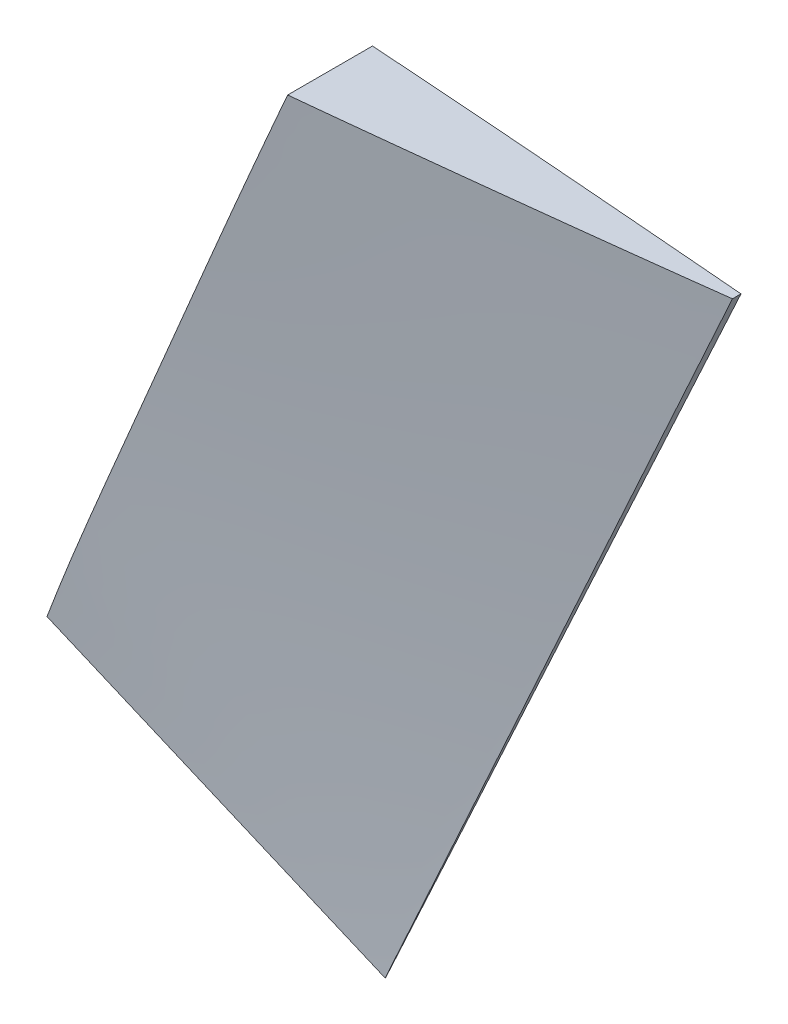
ISO-10303-21;
HEADER;
FILE_DESCRIPTION(('STEP AP214'),'2;1');
FILE_NAME('part.step','',(''),(''),'','','');
FILE_SCHEMA(('AUTOMOTIVE_DESIGN { 1 0 10303 214 1 1 1 1 }'));
ENDSEC;
DATA;
#1=APPLICATION_CONTEXT('core data for automotive mechanical design processes');
#2=APPLICATION_PROTOCOL_DEFINITION('international standard','automotive_design',2000,#1);
#3=PRODUCT_CONTEXT('',#1,'mechanical');
#4=PRODUCT('Part','Part','',(#3));
#5=PRODUCT_RELATED_PRODUCT_CATEGORY('part','',(#4));
#6=PRODUCT_DEFINITION_FORMATION('','',#4);
#7=PRODUCT_DEFINITION_CONTEXT('part definition',#1,'design');
#8=PRODUCT_DEFINITION('design','',#6,#7);
#9=PRODUCT_DEFINITION_SHAPE('','',#8);
#10=(LENGTH_UNIT() NAMED_UNIT(*) SI_UNIT(.MILLI.,.METRE.));
#11=(NAMED_UNIT(*) PLANE_ANGLE_UNIT() SI_UNIT($,.RADIAN.));
#12=(NAMED_UNIT(*) SI_UNIT($,.STERADIAN.) SOLID_ANGLE_UNIT());
#13=UNCERTAINTY_MEASURE_WITH_UNIT(LENGTH_MEASURE(1.E-05),#10,'distance_accuracy_value','');
#14=(GEOMETRIC_REPRESENTATION_CONTEXT(3) GLOBAL_UNCERTAINTY_ASSIGNED_CONTEXT((#13)) GLOBAL_UNIT_ASSIGNED_CONTEXT((#10,
#11,#12)) REPRESENTATION_CONTEXT('',''));
#15=CARTESIAN_POINT('',(0.,0.,0.));
#16=DIRECTION('',(0.,0.,1.));
#17=DIRECTION('',(1.,0.,0.));
#18=AXIS2_PLACEMENT_3D('',#15,#16,#17);
#19=CARTESIAN_POINT('',(450.,-130.454545454545,-0.340909090909091));
#20=CARTESIAN_POINT('',(450.,-130.454545454545,-0.340909090909106));
#21=CARTESIAN_POINT('',(449.920228231632,-130.628433739385,-0.340002593541267));
#22=CARTESIAN_POINT('',(449.545307522729,-130.454545454545,-0.371884642003111));
#23=CARTESIAN_POINT('',(449.762017008169,-130.97330610279,-0.338204738729196));
#24=CARTESIAN_POINT('',(448.643516643582,-130.454545454545,-0.433318404049909));
#25=CARTESIAN_POINT('',(449.525374432243,-131.489144882467,-0.335515618548219));
#26=CARTESIAN_POINT('',(447.297268547455,-130.454545454545,-0.557746313568504));
#27=CARTESIAN_POINT('',(449.211660247133,-132.172986079604,-0.331950684626506));
#28=CARTESIAN_POINT('',(445.511407799292,-130.454545454545,-0.708445804476921));
#29=CARTESIAN_POINT('',(448.427551942379,-133.882202899424,-0.323040362981583));
#30=CARTESIAN_POINT('',(441.047749772159,-130.454545454545,-1.08535856756838));
#31=CARTESIAN_POINT('',(447.408301592852,-136.103987607557,-0.311457972646045));
#32=CARTESIAN_POINT('',(435.244035903331,-130.454545454545,-1.5575400600512));
#33=CARTESIAN_POINT('',(445.918860764441,-139.350704037692,-0.294532508686824));
#34=CARTESIAN_POINT('',(426.762096799439,-130.454545454545,-2.23610225072945));
#35=CARTESIAN_POINT('',(444.194892841565,-143.108647873699,-0.274941964108699));
#36=CARTESIAN_POINT('',(416.943279708709,-130.454545454545,-3.00503063952915));
#37=CARTESIAN_POINT('',(442.236588852758,-147.377402707313,-0.252688509690426));
#38=CARTESIAN_POINT('',(405.783941156149,-130.454545454545,-3.80271359757555));
#39=CARTESIAN_POINT('',(440.123249434244,-151.984107238073,-0.228673289025499));
#40=CARTESIAN_POINT('',(393.730562897451,-130.454545454545,-4.50078656466239));
#41=CARTESIAN_POINT('',(438.480607326883,-155.564775242514,-0.210006901441855));
#42=CARTESIAN_POINT('',(384.353271804944,-130.454545454545,-4.87727949248391));
#43=CARTESIAN_POINT('',(436.760683946354,-159.313902694655,-0.190462317572211));
#44=CARTESIAN_POINT('',(374.53012498343,-130.454545454545,-5.10863819831831));
#45=CARTESIAN_POINT('',(434.65059264316,-163.913526910996,-0.166484007308637));
#46=CARTESIAN_POINT('',(362.475494514813,-130.454545454545,-5.22576076086143));
#47=CARTESIAN_POINT('',(432.227870836609,-169.194630090749,-0.138953077688741));
#48=CARTESIAN_POINT('',(348.635012099548,-130.454545454545,-5.04718611151635));
#49=CARTESIAN_POINT('',(430.117674255557,-173.79448379412,-0.11497357108587));
#50=CARTESIAN_POINT('',(336.582549321464,-130.454545454545,-4.78263940618856));
#51=CARTESIAN_POINT('',(428.632516792799,-177.031863248002,-0.0980967817363583));
#52=CARTESIAN_POINT('',(328.10042619195,-130.454545454545,-4.57892884845703));
#53=CARTESIAN_POINT('',(427.303541903018,-179.928792436182,-0.0829947943524758));
#54=CARTESIAN_POINT('',(320.510631665796,-130.454545454545,-4.3829699026139));
#55=CARTESIAN_POINT('',(425.817871302383,-183.167290439487,-0.0661121738907137));
#56=CARTESIAN_POINT('',(312.027201059706,-130.454545454545,-4.11838336615603));
#57=CARTESIAN_POINT('',(424.80112058878,-185.383626385326,-0.0545581885088574));
#58=CARTESIAN_POINT('',(306.22389672345,-130.454545454545,-3.86445582077895));
#59=CARTESIAN_POINT('',(424.17517976542,-186.74806619168,-0.0474452246070489));
#60=CARTESIAN_POINT('',(302.654005807109,-130.454545454545,-3.65622425154459));
#61=CARTESIAN_POINT('',(423.940270913742,-187.260125760466,-0.0447758058379719));
#62=CARTESIAN_POINT('',(301.3147605355,-130.454545454545,-3.56998476988364));
#63=CARTESIAN_POINT('',(423.705277623011,-187.772369391388,-0.0421054275342117));
#64=CARTESIAN_POINT('',(299.975128374365,-130.454545454545,-3.48252164984421));
#65=CARTESIAN_POINT('',(423.468929916839,-188.287565407379,-0.0394196581458948));
#66=CARTESIAN_POINT('',(298.629770656884,-130.454545454545,-3.36408099040977));
#67=CARTESIAN_POINT('',(423.198366270574,-188.877346094849,-0.0363450712565183));
#68=CARTESIAN_POINT('',(297.084298247488,-130.454545454545,-3.3152853906193));
#69=CARTESIAN_POINT('',(422.893539280858,-189.541814784696,-0.0328811281915655));
#70=CARTESIAN_POINT('',(295.348313714724,-130.454545454545,-3.17425916277371));
#71=CARTESIAN_POINT('',(422.441895643322,-190.526317687117,-0.0277488141286567));
#72=CARTESIAN_POINT('',(292.773890539923,-130.454545454545,-2.99674488123777));
#73=CARTESIAN_POINT('',(421.98911807893,-191.51329234866,-0.0226036145332886));
#74=CARTESIAN_POINT('',(290.210161536907,-130.454545454545,-2.63081723262685));
#75=CARTESIAN_POINT('',(421.535232774317,-192.502681687109,-0.017445826980876));
#76=CARTESIAN_POINT('',(287.652988807389,-130.454545454545,-2.21850885010889));
#77=CARTESIAN_POINT('',(421.193710642188,-193.247139269101,-0.013564893661225));
#78=CARTESIAN_POINT('',(285.718160266892,-130.454545454545,-1.91157573945579));
#79=CARTESIAN_POINT('',(420.849742018622,-193.996929767844,-0.00965615930252281));
#80=CARTESIAN_POINT('',(283.811789954257,-130.454545454545,-1.57794652407751));
#81=CARTESIAN_POINT('',(420.495200364726,-194.769767594573,-0.00562727687188866));
#82=CARTESIAN_POINT('',(281.721851115223,-130.454545454545,-1.10038705084091));
#83=CARTESIAN_POINT('',(420.240954683221,-195.323978017497,-0.00273812140024109));
#84=CARTESIAN_POINT('',(280.715924876587,-130.454545454545,-0.480848687373534));
#85=CARTESIAN_POINT('',(420.086812970164,-195.659979571103,-0.000986511024594086));
#86=CARTESIAN_POINT('',(279.659362327828,-130.454545454545,-0.000901808903122984));
#87=CARTESIAN_POINT('',(420.043325889078,-195.754773683073,-0.000492339648617432));
#88=CARTESIAN_POINT('',(279.947253509353,-130.454545454545,0.187389481134261));
#89=CARTESIAN_POINT('',(420.013652124563,-195.819457218637,-0.000155137779127834));
#90=CARTESIAN_POINT('',(280.114902417443,-130.454545454545,0.304929247207996));
#91=CARTESIAN_POINT('',(420.,-195.849216425099,0.));
#92=CARTESIAN_POINT('',(280.187278611803,-130.454545454545,0.357040530711377));
#93=B_SPLINE_SURFACE_WITH_KNOTS('',3,1,((#19,#20),(#21,#22),(#23,#24),(#25,#26),(#27,#28),(#29,
#30),(#31,#32),(#33,#34),(#35,#36),(#37,#38),(#39,#40),(#41,#42),(#43,#44),(#45,#46),(#47,#48),
(#49,#50),(#51,#52),(#53,#54),(#55,#56),(#57,#58),(#59,#60),(#61,#62),(#63,#64),(#65,#66),(#67,
#68),(#69,#70),(#71,#72),(#73,#74),(#75,#76),(#77,#78),(#79,#80),(#81,#82),(#83,#84),(#85,#86),
(#87,#88),(#89,#90),(#91,#92)),.UNSPECIFIED.,.F.,.F.,.F.,(4,1,1,1,1,1,1,1,1,1,1,1,1,1,1,1,1,1,1,
1,1,1,1,1,1,1,1,1,1,1,1,1,1,1,4),(2,2),(0.,0.00797717683684673,0.0158211223462278,
0.0236642575925995,0.0393485953479212,0.0942319528215491,0.125589292545331,0.188292678189065,
0.266628745109053,0.321419691426134,0.399626620040427,0.430892955845112,0.493412029479,
0.610635750359878,0.673165136500196,0.704431687584267,0.759151496635583,0.806062625478363,
0.852998747647773,0.86082656799592,0.868656707814277,0.87648963281565,0.884325897069009,
0.892291478431467,0.903545997442163,0.914808596040594,0.937455842185065,0.948823753881402,
0.960197126501825,0.971608055397993,0.983220616237981,0.995651291891405,0.997032623548492,
0.998634787543675,1.),(0.,1.),.UNSPECIFIED.);
#94=CARTESIAN_POINT('',(398.614550998263,-181.43067022012,-0.427699893424422));
#95=CARTESIAN_POINT('',(402.45676464004,-183.22779064241,-0.358518283381793));
#96=CARTESIAN_POINT('',(406.298985972093,-185.024914661675,-0.289865295132148));
#97=CARTESIAN_POINT('',(413.983444016749,-188.619169894159,-0.153616562218825));
#98=CARTESIAN_POINT('',(417.825680729353,-190.416301107377,-0.0860208175551474));
#99=CARTESIAN_POINT('',(421.667925132232,-192.213435917571,-0.0189536946844526));
#100=B_SPLINE_CURVE_WITH_KNOTS('',3,(#94,#95,#96,#97,#98,#99),.UNSPECIFIED.,.F.,.F.,(4,2,4),(0.,
12.7268729325426,25.4537458650852),.UNSPECIFIED.);
#101=CARTESIAN_POINT('',(398.614550998263,-181.43067022012,-0.427699893424439));
#102=VERTEX_POINT('',#101);
#103=CARTESIAN_POINT('',(421.667925132232,-192.213435917571,-0.018953694684444));
#104=VERTEX_POINT('',#103);
#105=EDGE_CURVE('E159',#102,#104,#100,.T.);
#106=CARTESIAN_POINT('',(418.329976182492,-138.454545454545,-2.43344554744445));
#107=CARTESIAN_POINT('',(418.124501030356,-138.902444786763,-2.41977298470673));
#108=CARTESIAN_POINT('',(417.919034875398,-139.350324506732,-2.40533292954151));
#109=CARTESIAN_POINT('',(417.50812210439,-140.246041355323,-2.37496045053862));
#110=CARTESIAN_POINT('',(417.302675488305,-140.693878484019,-2.35902802938084));
#111=CARTESIAN_POINT('',(416.686372314229,-142.037309926913,-2.30905656219624));
#112=CARTESIAN_POINT('',(416.275546273283,-142.932837719373,-2.27284290020665));
#113=CARTESIAN_POINT('',(415.453992594572,-144.723678802838,-2.19564429085679));
#114=CARTESIAN_POINT('',(415.043264953058,-145.618992102015,-2.15465957034874));
#115=CARTESIAN_POINT('',(414.221881024471,-147.409463160363,-2.06871873170473));
#116=CARTESIAN_POINT('',(413.811224737652,-148.304620918981,-2.02376259974717));
#117=CARTESIAN_POINT('',(413.195284191508,-149.647261897396,-1.95462014402665));
#118=CARTESIAN_POINT('',(412.989982973283,-150.094782084587,-1.93128853626097));
#119=CARTESIAN_POINT('',(412.579388382882,-150.989805355972,-1.8842430018646));
#120=CARTESIAN_POINT('',(412.374095010697,-151.437308440186,-1.86052907570626));
#121=CARTESIAN_POINT('',(411.758219652784,-152.779807319841,-1.7890475564416));
#122=CARTESIAN_POINT('',(411.347644559846,-153.67478809022,-1.74094046552913));
#123=CARTESIAN_POINT('',(410.526479901909,-155.464781177502,-1.64545237755797));
#124=CARTESIAN_POINT('',(410.115890336921,-156.359793494378,-1.59807137992408));
#125=CARTESIAN_POINT('',(409.2946735918,-158.149900122469,-1.50524597129407));
#126=CARTESIAN_POINT('',(408.884046411736,-159.044994433532,-1.45980155678513));
#127=CARTESIAN_POINT('',(408.062737691389,-160.835301551276,-1.37170219790142));
#128=CARTESIAN_POINT('',(407.65205615084,-161.730514358539,-1.32904726777316));
#129=CARTESIAN_POINT('',(406.830637853039,-163.521060335668,-1.24690556248461));
#130=CARTESIAN_POINT('',(406.419901095784,-164.416393505542,-1.20741878752368));
#131=CARTESIAN_POINT('',(405.598379779897,-166.207164043799,-1.13152295577012));
#132=CARTESIAN_POINT('',(405.187595221424,-167.102601411836,-1.09511388904415));
#133=CARTESIAN_POINT('',(404.571399298036,-168.44579906728,-1.04178885977681));
#134=CARTESIAN_POINT('',(404.365997458045,-168.893538592046,-1.02422861034925));
#135=CARTESIAN_POINT('',(403.955189630234,-169.789026683107,-0.989385053070753));
#136=CARTESIAN_POINT('',(403.749783642413,-170.236775249405,-0.972101745297287));
#137=CARTESIAN_POINT('',(403.338973726159,-171.132267892901,-0.937447460374475));
#138=CARTESIAN_POINT('',(403.133569797721,-171.580011970109,-0.920076483557113));
#139=CARTESIAN_POINT('',(402.825468476758,-172.251618120442,-0.893707493865172));
#140=CARTESIAN_POINT('',(402.722768765811,-172.475485247315,-0.884865740369396));
#141=CARTESIAN_POINT('',(402.51737132289,-172.923215187247,-0.86703223569354));
#142=CARTESIAN_POINT('',(402.414673590923,-173.147078000294,-0.858040484105255));
#143=CARTESIAN_POINT('',(402.23491614752,-173.538917295823,-0.842112663908749));
#144=CARTESIAN_POINT('',(402.157855710809,-173.706895359274,-0.835223726115662));
#145=CARTESIAN_POINT('',(402.003737167091,-174.042846407839,-0.821299671711394));
#146=CARTESIAN_POINT('',(401.926679060081,-174.210819392955,-0.814264555169191));
#147=CARTESIAN_POINT('',(401.772566284141,-174.546757868789,-0.800023897979708));
#148=CARTESIAN_POINT('',(401.695511615184,-174.714723359561,-0.79281835888474));
#149=CARTESIAN_POINT('',(401.541405386301,-175.050647563972,-0.778212628709008));
#150=CARTESIAN_POINT('',(401.464353826378,-175.218606277602,-0.770812437393759));
#151=CARTESIAN_POINT('',(401.348779489199,-175.470537802684,-0.75955128969145));
#152=CARTESIAN_POINT('',(401.310255347104,-175.554513589242,-0.755770777351224));
#153=CARTESIAN_POINT('',(401.233208136475,-175.722462822184,-0.748148924534132));
#154=CARTESIAN_POINT('',(401.194685067942,-175.806436268568,-0.744307584103872));
#155=CARTESIAN_POINT('',(401.117640465881,-175.974379815296,-0.736540023284931));
#156=CARTESIAN_POINT('',(401.079118932352,-176.058349915643,-0.732613803004664));
#157=CARTESIAN_POINT('',(401.002077291851,-176.226287006697,-0.724678021698815));
#158=CARTESIAN_POINT('',(400.963557184881,-176.310253997398,-0.72066846052391));
#159=CARTESIAN_POINT('',(400.886516042725,-176.478190002148,-0.712645665474862));
#160=CARTESIAN_POINT('',(400.84799500754,-176.562159016192,-0.708632431507985));
#161=CARTESIAN_POINT('',(400.770953780904,-176.730095205094,-0.700568010909255));
#162=CARTESIAN_POINT('',(400.732433589449,-176.814062379958,-0.696516824452922));
#163=CARTESIAN_POINT('',(400.674657416914,-176.940004173052,-0.690236101523164));
#164=CARTESIAN_POINT('',(400.655399528339,-176.981982949284,-0.688108554020083));
#165=CARTESIAN_POINT('',(400.616885818008,-177.065935996449,-0.683748379243098));
#166=CARTESIAN_POINT('',(400.597629996253,-177.107910267381,-0.681515751937869));
#167=CARTESIAN_POINT('',(400.539864044893,-177.233829780131,-0.674740613284575));
#168=CARTESIAN_POINT('',(400.501355500184,-177.317771567156,-0.670120853144431));
#169=CARTESIAN_POINT('',(400.437158619949,-177.4577093625,-0.662903701716677));
#170=CARTESIAN_POINT('',(400.411473564835,-177.513698220101,-0.66014532604083));
#171=CARTESIAN_POINT('',(400.360094979825,-177.625694408824,-0.655133960014648));
#172=CARTESIAN_POINT('',(400.334401449964,-177.681701739869,-0.652880967598505));
#173=CARTESIAN_POINT('',(400.283010772088,-177.793724288891,-0.648638231293811));
#174=CARTESIAN_POINT('',(400.257313624061,-177.849739506893,-0.646648488231127));
#175=CARTESIAN_POINT('',(400.205919361301,-177.961769870326,-0.642660420700276));
#176=CARTESIAN_POINT('',(400.180222246566,-178.017785015758,-0.640662096231791));
#177=CARTESIAN_POINT('',(400.103139844435,-178.185810959924,-0.63417316934824));
#178=CARTESIAN_POINT('',(400.051761740874,-178.297806099174,-0.629188510561764));
#179=CARTESIAN_POINT('',(399.949018653572,-178.521767778794,-0.61851900008417));
#180=CARTESIAN_POINT('',(399.897653669917,-178.633734318979,-0.6128341439467));
#181=CARTESIAN_POINT('',(399.820605072007,-178.801686575946,-0.604437045282648));
#182=CARTESIAN_POINT('',(399.794922725036,-178.857669530278,-0.60165978454755));
#183=CARTESIAN_POINT('',(399.743556764957,-178.969638198894,-0.596173159132351));
#184=CARTESIAN_POINT('',(399.717873151848,-179.02562391318,-0.593463794523611));
#185=CARTESIAN_POINT('',(399.640823443593,-179.193578590504,-0.585285556704713));
#186=CARTESIAN_POINT('',(399.589458190804,-179.305545717352,-0.579766509610423));
#187=CARTESIAN_POINT('',(399.512423073757,-179.473468588434,-0.570906604565404));
#188=CARTESIAN_POINT('',(399.486747488261,-179.52943680395,-0.567856499690711));
#189=CARTESIAN_POINT('',(399.435402210096,-179.641360389668,-0.561483211600029));
#190=CARTESIAN_POINT('',(399.409732517425,-179.697315759871,-0.558160028393684));
#191=CARTESIAN_POINT('',(399.332732093306,-179.865163006533,-0.54782477576804));
#192=CARTESIAN_POINT('',(399.281409881338,-179.977036312036,-0.540446987861615));
#193=CARTESIAN_POINT('',(399.178780715239,-180.200749663671,-0.524926269444932));
#194=CARTESIAN_POINT('',(399.127473763129,-180.312589705397,-0.516783263035843));
#195=CARTESIAN_POINT('',(399.0248754874,-180.53623572151,-0.499938988772779));
#196=CARTESIAN_POINT('',(398.973584163912,-180.648041695616,-0.49123771642716));
#197=CARTESIAN_POINT('',(398.870999413006,-180.871658230019,-0.473481019394629));
#198=CARTESIAN_POINT('',(398.819705988255,-180.983468784503,-0.464425506911519));
#199=CARTESIAN_POINT('',(398.717125407099,-181.207076229591,-0.446144620998084));
#200=CARTESIAN_POINT('',(398.665838250591,-181.318873120422,-0.43691925094031));
#201=CARTESIAN_POINT('',(398.614550998263,-181.43067022012,-0.427699893424429));
#202=B_SPLINE_CURVE_WITH_KNOTS('',3,(#106,#107,#108,#109,#110,#111,#112,#113,#114,#115,#116,
#117,#118,#119,#120,#121,#122,#123,#124,#125,#126,#127,#128,#129,#130,#131,#132,#133,#134,#135,
#136,#137,#138,#139,#140,#141,#142,#143,#144,#145,#146,#147,#148,#149,#150,#151,#152,#153,#154,
#155,#156,#157,#158,#159,#160,#161,#162,#163,#164,#165,#166,#167,#168,#169,#170,#171,#172,#173,
#174,#175,#176,#177,#178,#179,#180,#181,#182,#183,#184,#185,#186,#187,#188,#189,#190,#191,#192,
#193,#194,#195,#196,#197,#198,#199,#200,#201),.UNSPECIFIED.,.F.,.F.,(4,2,2,2,2,2,2,2,2,2,2,2,2,
2,2,2,2,2,2,2,2,2,2,2,2,2,2,2,2,2,2,2,2,2,2,2,2,2,2,2,2,2,2,2,2,2,2,4),(0.,1.47891307515781,
2.95782349463871,5.91560001796166,8.87323596360744,11.8308822030435,13.3096335313171,
14.7883830327641,17.7458974076548,20.7034094395692,23.6609161065599,26.6184378770072,
29.5759598335588,32.5334722443277,34.0122287076632,35.490985584583,36.9697368659515,
37.709112975692,38.4484910978998,39.0033077617632,39.5581241638288,40.1129355142401,
40.6677475330287,40.9451515763426,41.2225554071194,41.499958883598,41.7773628571418,
42.0547740394756,42.3321839395015,42.470886731057,42.609589563961,42.8869957410793,
43.0719773259479,43.256958154671,43.441939563703,43.6269209796161,43.9968711582598,
44.3668236862604,44.5517897804406,44.7367560690163,45.1066865669963,45.2916423076045,
45.4765980416811,45.8465085417035,46.2164557704083,46.586405975973,46.9564484596269,
47.3264836039297),.UNSPECIFIED.);
#203=CARTESIAN_POINT('',(418.329976182492,-138.454545454545,-2.43344554744446));
#204=VERTEX_POINT('',#203);
#205=EDGE_CURVE('E142',#204,#102,#202,.T.);
#206=CARTESIAN_POINT('',(446.329976182488,-138.454545454545,-0.299204274801055));
#207=CARTESIAN_POINT('',(445.552536679029,-138.454545454545,-0.362710519299194));
#208=CARTESIAN_POINT('',(444.77508324772,-138.454545454545,-0.426046564859201));
#209=CARTESIAN_POINT('',(443.220144077697,-138.454545454545,-0.55232570928262));
#210=CARTESIAN_POINT('',(442.442658338968,-138.454545454545,-0.615268807945163));
#211=CARTESIAN_POINT('',(440.887650812662,-138.454545454545,-0.740709451540716));
#212=CARTESIAN_POINT('',(440.110129025081,-138.454545454545,-0.803206996425302));
#213=CARTESIAN_POINT('',(438.555053065399,-138.454545454545,-0.927668132712082));
#214=CARTESIAN_POINT('',(437.777498893861,-138.454545454545,-0.9896317311674));
#215=CARTESIAN_POINT('',(436.222340356082,-138.454545454545,-1.1129267307817));
#216=CARTESIAN_POINT('',(435.444735989842,-138.454545454545,-1.17425813196287));
#217=CARTESIAN_POINT('',(433.889468605383,-138.454545454545,-1.29617335247123));
#218=CARTESIAN_POINT('',(433.111805587143,-138.454545454545,-1.35675717153314));
#219=CARTESIAN_POINT('',(430.000916497162,-138.454545454545,-1.59732551756707));
#220=CARTESIAN_POINT('',(427.667411716101,-138.454545454545,-1.77376074310555));
#221=CARTESIAN_POINT('',(424.166457108495,-138.454545454545,-2.02906265231637));
#222=CARTESIAN_POINT('',(422.999348585287,-138.454545454545,-2.11260530143197));
#223=CARTESIAN_POINT('',(420.664867568699,-138.454545454545,-2.27596841140747));
#224=CARTESIAN_POINT('',(419.497495074471,-138.454545454545,-2.35578886014299));
#225=CARTESIAN_POINT('',(418.329976182492,-138.454545454545,-2.43344554744444));
#226=B_SPLINE_CURVE_WITH_KNOTS('',3,(#206,#207,#208,#209,#210,#211,#212,#213,#214,#215,#216,
#217,#218,#219,#220,#221,#222,#223,#224,#225),.UNSPECIFIED.,.F.,.F.,(4,2,2,2,2,2,2,2,2,4),(0.,
2.3400869852755,4.68017516667034,7.02026360238659,9.36032107935536,11.7003784742111,
14.0404366994646,21.0609052764254,24.571184153648,28.0814744641483),.UNSPECIFIED.);
#227=CARTESIAN_POINT('',(446.329976182493,-138.454545454545,-0.299204274801072));
#228=VERTEX_POINT('',#227);
#229=EDGE_CURVE('E130',#228,#204,#226,.T.);
#230=DIRECTION('',(-0.416965212118543,-0.908910095089014,0.00473824104680372));
#231=VECTOR('',#230,1.);
#232=CARTESIAN_POINT('',(435.,-163.151880939822,-0.170454545454545));
#233=LINE('',#232,#231);
#234=EDGE_CURVE('E136',#228,#104,#233,.T.);
#235=ORIENTED_EDGE('',*,*,#105,.F.);
#236=ORIENTED_EDGE('',*,*,#205,.F.);
#237=ORIENTED_EDGE('',*,*,#229,.F.);
#238=ORIENTED_EDGE('',*,*,#234,.T.);
#239=EDGE_LOOP('',(#235,#236,#237,#238));
#240=FACE_BOUND('',#239,.T.);
#241=ADVANCED_FACE('F85',(#240),#93,.T.);
#242=CARTESIAN_POINT('',(420.,-195.849216425099,0.));
#243=CARTESIAN_POINT('',(280.187278611803,-130.454545454545,0.35704053071139));
#244=CARTESIAN_POINT('',(420.071151014709,-195.694119851896,0.000808534258051717));
#245=CARTESIAN_POINT('',(280.564482881045,-130.454545454545,0.628629812061183));
#246=CARTESIAN_POINT('',(420.221036678357,-195.367395729979,0.00251178043587693));
#247=CARTESIAN_POINT('',(281.087036720018,-130.454545454545,1.08828051002727));
#248=CARTESIAN_POINT('',(420.44583156894,-194.877382799796,0.00506626782885661));
#249=CARTESIAN_POINT('',(282.274174192472,-130.454545454545,1.75247690226862));
#250=CARTESIAN_POINT('',(420.672097389311,-194.384163503961,0.00763747033307473));
#251=CARTESIAN_POINT('',(283.432642754446,-130.454545454545,2.2838866728495));
#252=CARTESIAN_POINT('',(420.890951919168,-193.907099504947,0.0101244536269029));
#253=CARTESIAN_POINT('',(284.611810181569,-130.454545454545,2.71697102781261));
#254=CARTESIAN_POINT('',(421.105531130917,-193.439354939965,0.0125628537604167));
#255=CARTESIAN_POINT('',(285.782029494811,-130.454545454545,3.07884482997964));
#256=CARTESIAN_POINT('',(421.38800658309,-192.823608631562,0.0157728020805624));
#257=CARTESIAN_POINT('',(287.338994271212,-130.454545454545,3.50546181963184));
#258=CARTESIAN_POINT('',(421.669366361993,-192.210294292705,0.0189700722953707));
#259=CARTESIAN_POINT('',(288.898985076652,-130.454545454545,3.89238031397816));
#260=CARTESIAN_POINT('',(421.961982914711,-191.572442186519,0.0222952603944451));
#261=CARTESIAN_POINT('',(290.518535065987,-130.454545454545,4.30673885902615));
#262=CARTESIAN_POINT('',(422.198093289187,-191.057763511467,0.0249783328316695));
#263=CARTESIAN_POINT('',(291.830238795819,-130.454545454545,4.62128878184873));
#264=CARTESIAN_POINT('',(422.447647314156,-190.513780066393,0.027814174024496));
#265=CARTESIAN_POINT('',(293.214948862898,-130.454545454545,4.96084399636247));
#266=CARTESIAN_POINT('',(422.698654705306,-189.966628541212,0.0306665307421089));
#267=CARTESIAN_POINT('',(294.616035403953,-130.454545454545,5.2668486340114));
#268=CARTESIAN_POINT('',(422.948733034197,-189.421502206722,0.0335083299340544));
#269=CARTESIAN_POINT('',(296.016447086324,-130.454545454545,5.54983796405608));
#270=CARTESIAN_POINT('',(423.610047730074,-187.979953641894,0.0410232696599231));
#271=CARTESIAN_POINT('',(299.731773505077,-130.454545454545,6.23626957204611));
#272=CARTESIAN_POINT('',(424.516068043252,-186.004990299463,0.0513189550369489));
#273=CARTESIAN_POINT('',(304.866582782226,-130.454545454545,6.91262465631221));
#274=CARTESIAN_POINT('',(425.666420599626,-183.497426068655,0.0643911431775677));
#275=CARTESIAN_POINT('',(311.415146319476,-130.454545454545,7.47468891132479));
#276=CARTESIAN_POINT('',(426.648992540881,-181.355593775213,0.0755567334191007));
#277=CARTESIAN_POINT('',(317.018524509153,-130.454545454545,7.81425292200262));
#278=CARTESIAN_POINT('',(427.630468427647,-179.216150685859,0.086709868495992));
#279=CARTESIAN_POINT('',(322.620466347349,-130.454545454545,8.05767756577288));
#280=CARTESIAN_POINT('',(428.61140122065,-177.077891444439,0.0978568320528347));
#281=CARTESIAN_POINT('',(328.221716601722,-130.454545454545,8.23485378957612));
#282=CARTESIAN_POINT('',(429.837150819099,-174.405975055008,0.111785804762494));
#283=CARTESIAN_POINT('',(335.222522761133,-130.454545454545,8.39552973880935));
#284=CARTESIAN_POINT('',(431.71633953175,-170.30967746983,0.133140221951699));
#285=CARTESIAN_POINT('',(345.957430556797,-130.454545454545,8.53689315986166));
#286=CARTESIAN_POINT('',(433.922537048939,-165.500558778742,0.158210648283398));
#287=CARTESIAN_POINT('',(358.562250470617,-130.454545454545,8.48861665967984));
#288=CARTESIAN_POINT('',(435.883965833054,-161.22499244643,0.180499611739247));
#289=CARTESIAN_POINT('',(369.76341516376,-130.454545454545,8.15389854092615));
#290=CARTESIAN_POINT('',(437.519955552744,-157.658825465417,0.199090404008459));
#291=CARTESIAN_POINT('',(379.099265936947,-130.454545454545,7.70948541929537));
#292=CARTESIAN_POINT('',(438.829910757077,-154.803355812967,0.213976258603151));
#293=CARTESIAN_POINT('',(386.567440595166,-130.454545454545,7.22127042959768));
#294=CARTESIAN_POINT('',(440.633334547504,-150.872212299785,0.234469710767096));
#295=CARTESIAN_POINT('',(396.836789768627,-130.454545454545,6.39031919584628));
#296=CARTESIAN_POINT('',(442.439025038754,-146.936127781454,0.254988920894931));
#297=CARTESIAN_POINT('',(407.10519128926,-130.454545454545,5.39914332150518));
#298=CARTESIAN_POINT('',(444.245616478655,-142.998079355102,0.275518369075627));
#299=CARTESIAN_POINT('',(417.367847728984,-130.454545454545,4.30402449553109));
#300=CARTESIAN_POINT('',(445.560420545534,-140.132040043627,0.290459324381062));
#301=CARTESIAN_POINT('',(424.834343364726,-130.454545454545,3.48430379735418));
#302=CARTESIAN_POINT('',(446.629272324157,-137.802133030982,0.302605367319963));
#303=CARTESIAN_POINT('',(430.902643251865,-130.454545454545,2.80451180973997));
#304=CARTESIAN_POINT('',(447.698757611424,-135.470845082026,0.314758609220726));
#305=CARTESIAN_POINT('',(436.971792813155,-130.454545454545,2.09993903056582));
#306=CARTESIAN_POINT('',(448.604315352224,-133.49689006521,0.325049038093456));
#307=CARTESIAN_POINT('',(442.105109979127,-130.454545454545,1.45684168825263));
#308=CARTESIAN_POINT('',(449.181137684725,-132.239519843798,0.33160383732642));
#309=CARTESIAN_POINT('',(445.370231574772,-130.454545454545,1.01145852772402));
#310=CARTESIAN_POINT('',(449.511176048923,-131.520094835986,0.335354273283212));
#311=CARTESIAN_POINT('',(447.236915623379,-130.454545454545,0.745780183520897));
#312=CARTESIAN_POINT('',(449.756671433744,-130.984958505481,0.338143993565268));
#313=CARTESIAN_POINT('',(448.623337919136,-130.454545454545,0.533918312824093));
#314=CARTESIAN_POINT('',(449.919634152885,-130.629728725524,0.339995842646417));
#315=CARTESIAN_POINT('',(449.545320074736,-130.454545454545,0.404655612161846));
#316=CARTESIAN_POINT('',(450.,-130.454545454545,0.340909090909091));
#317=CARTESIAN_POINT('',(450.,-130.454545454545,0.340909090909076));
#318=B_SPLINE_SURFACE_WITH_KNOTS('',3,1,((#242,#243),(#244,#245),(#246,#247),(#248,#249),(#250,
#251),(#252,#253),(#254,#255),(#256,#257),(#258,#259),(#260,#261),(#262,#263),(#264,#265),(#266,
#267),(#268,#269),(#270,#271),(#272,#273),(#274,#275),(#276,#277),(#278,#279),(#280,#281),(#282,
#283),(#284,#285),(#286,#287),(#288,#289),(#290,#291),(#292,#293),(#294,#295),(#296,#297),(#298,
#299),(#300,#301),(#302,#303),(#304,#305),(#306,#307),(#308,#309),(#310,#311),(#312,#313),(#314,
#315),(#316,#317)),.UNSPECIFIED.,.F.,.F.,.F.,(4,1,1,1,1,1,1,1,1,1,1,1,1,1,1,1,1,1,1,1,1,1,1,1,1,
1,1,1,1,1,1,1,1,1,1,4),(2,2),(0.,0.00711510147085559,0.0149885663648619,0.0224794890582212,
0.029741683507975,0.03687401935055,0.0439374102331422,0.0579892287252576,0.065009997240863,
0.0731990655049966,0.0816002661728324,0.0899653997377364,0.0982998046199896,0.106608099061953,
0.156096869325381,0.188901835937816,0.221643354699399,0.254354063450871,0.28704942461446,
0.319736633999615,0.37692902329587,0.474968295879467,0.540356385718565,0.573071901707337,
0.638567267848534,0.67135190615186,0.753414280750055,0.819136316973473,0.852011050141986,
0.884894687437888,0.926021494835804,0.958959578868695,0.97545046151791,0.983703728085889,
0.991963415288466,1.),(0.,1.),.UNSPECIFIED.);
#319=CARTESIAN_POINT('',(421.667925132241,-192.213435917576,0.0189536946844504));
#320=CARTESIAN_POINT('',(417.82567181883,-190.416296939654,0.131195570276135));
#321=CARTESIAN_POINT('',(413.983430650959,-188.619163642572,0.243939670936143));
#322=CARTESIAN_POINT('',(406.2989726063,-185.024908410086,0.470432322392807));
#323=CARTESIAN_POINT('',(402.456755729511,-183.227786474683,0.584180873189464));
#324=CARTESIAN_POINT('',(398.614550998263,-181.43067022012,0.698431649054445));
#325=B_SPLINE_CURVE_WITH_KNOTS('',3,(#319,#320,#321,#322,#323,#324),.UNSPECIFIED.,.F.,.F.,(4,2,
4),(0.,12.7297662431861,25.4595324863723),.UNSPECIFIED.);
#326=CARTESIAN_POINT('',(421.667925132232,-192.213435917571,0.018953694684444));
#327=VERTEX_POINT('',#326);
#328=CARTESIAN_POINT('',(398.614550998263,-181.43067022012,0.698431649054431));
#329=VERTEX_POINT('',#328);
#330=EDGE_CURVE('E143',#327,#329,#325,.T.);
#331=DIRECTION('',(0.416965212118383,0.908910095089087,0.00473824104680329));
#332=VECTOR('',#331,1.);
#333=CARTESIAN_POINT('',(435.,-163.151880939822,0.170454545454545));
#334=LINE('',#333,#332);
#335=CARTESIAN_POINT('',(446.329976182489,-138.454545454543,0.299204274801054));
#336=VERTEX_POINT('',#335);
#337=EDGE_CURVE('E145',#327,#336,#334,.T.);
#338=CARTESIAN_POINT('',(418.329976182492,-138.454545454545,3.52270971745889));
#339=CARTESIAN_POINT('',(419.498048967753,-138.454545454545,3.40150156970858));
#340=CARTESIAN_POINT('',(420.665906357908,-138.454545454545,3.27823515127319));
#341=CARTESIAN_POINT('',(423.00123108525,-138.454545454545,3.02809050842047));
#342=CARTESIAN_POINT('',(424.168698423564,-138.454545454545,2.90121229453176));
#343=CARTESIAN_POINT('',(426.503259550903,-138.454545454545,2.64435149913933));
#344=CARTESIAN_POINT('',(427.670353349035,-138.454545454545,2.51436900028102));
#345=CARTESIAN_POINT('',(430.004220277665,-138.454545454545,2.25155601493259));
#346=CARTESIAN_POINT('',(431.170993408126,-138.454545454545,2.1187255281184));
#347=CARTESIAN_POINT('',(433.50436772263,-138.454545454545,1.85034359651225));
#348=CARTESIAN_POINT('',(434.670968869533,-138.454545454545,1.71479182888));
#349=CARTESIAN_POINT('',(437.003844450507,-138.454545454545,1.44091989825975));
#350=CARTESIAN_POINT('',(438.170118885085,-138.454545454545,1.30259973958974));
#351=CARTESIAN_POINT('',(440.502305000141,-138.454545454545,1.02265938331524));
#352=CARTESIAN_POINT('',(441.668216669843,-138.454545454545,0.881039095682787));
#353=CARTESIAN_POINT('',(443.416698382956,-138.454545454545,0.665461290645123));
#354=CARTESIAN_POINT('',(443.999462455764,-138.454545454544,0.593077316113604));
#355=CARTESIAN_POINT('',(445.16483895522,-138.454545454545,0.447093931859528));
#356=CARTESIAN_POINT('',(445.747451381696,-138.454545454546,0.37349452076777));
#357=CARTESIAN_POINT('',(446.329976182491,-138.454545454549,0.299204274801032));
#358=B_SPLINE_CURVE_WITH_KNOTS('',3,(#338,#339,#340,#341,#342,#343,#344,#345,#346,#347,#348,
#349,#350,#351,#352,#353,#354,#355,#356,#357),.UNSPECIFIED.,.F.,.F.,(4,2,2,2,2,2,2,2,2,4),(0.,
3.52302961117005,7.04604895352801,10.5689746068232,14.0919006609817,17.6152471580955,
21.1385881601136,24.66202539213,26.4237508647475,28.1854783220982),.UNSPECIFIED.);
#359=CARTESIAN_POINT('',(418.329976182492,-138.454545454545,3.52270971745888));
#360=VERTEX_POINT('',#359);
#361=EDGE_CURVE('E105',#360,#336,#358,.T.);
#362=CARTESIAN_POINT('',(398.614550998263,-181.43067022012,0.698431649054444));
#363=CARTESIAN_POINT('',(398.640085582678,-181.375009361915,0.705496454730695));
#364=CARTESIAN_POINT('',(398.665617554194,-181.319354199364,0.712615028765063));
#365=CARTESIAN_POINT('',(398.716678912353,-181.208049508826,0.726905681032231));
#366=CARTESIAN_POINT('',(398.742208298995,-181.152399980842,0.734077759296658));
#367=CARTESIAN_POINT('',(398.793267046148,-181.041100981833,0.748421364418086));
#368=CARTESIAN_POINT('',(398.81879640666,-180.985451510808,0.755592891276181));
#369=CARTESIAN_POINT('',(398.869858839087,-180.874144478557,0.769859414596927));
#370=CARTESIAN_POINT('',(398.895391911,-180.818486917336,0.776954411097843));
#371=CARTESIAN_POINT('',(398.971997244953,-180.651500897055,0.798142031638348));
#372=CARTESIAN_POINT('',(399.023074195384,-180.540162218134,0.812136883855771));
#373=CARTESIAN_POINT('',(399.099681954383,-180.373170911684,0.833290156204857));
#374=CARTESIAN_POINT('',(399.125216618733,-180.317509879232,0.840368085622345));
#375=CARTESIAN_POINT('',(399.176283228135,-180.20619374192,0.854580194933914));
#376=CARTESIAN_POINT('',(399.201815173183,-180.150538637064,0.861714374869066));
#377=CARTESIAN_POINT('',(399.278402580565,-179.983591693523,0.883067828470956));
#378=CARTESIAN_POINT('',(399.329460349373,-179.872294827134,0.897241034961811));
#379=CARTESIAN_POINT('',(399.431606620326,-179.649634101139,0.924932701430059));
#380=CARTESIAN_POINT('',(399.482695122346,-179.538270241806,0.938451164045169));
#381=CARTESIAN_POINT('',(399.584890793273,-179.315501832643,0.965055263752241));
#382=CARTESIAN_POINT('',(399.63599796189,-179.204097283444,0.978140907269558));
#383=CARTESIAN_POINT('',(399.738227930392,-178.98125411166,1.00396158397066));
#384=CARTESIAN_POINT('',(399.789350730339,-178.869815488941,1.0166966157398));
#385=CARTESIAN_POINT('',(399.891605680746,-178.646917861041,1.04176109330671));
#386=CARTESIAN_POINT('',(399.94273782856,-178.535458861629,1.05409060116571));
#387=CARTESIAN_POINT('',(400.045017591669,-178.312507146449,1.07837169727474));
#388=CARTESIAN_POINT('',(400.096165206932,-178.201014430746,1.09032328626326));
#389=CARTESIAN_POINT('',(400.249630158082,-177.866488097881,1.12565033610567));
#390=CARTESIAN_POINT('',(400.351968689906,-177.643408277339,1.14849785785438));
#391=CARTESIAN_POINT('',(400.556691764759,-177.197148340002,1.19288736043821));
#392=CARTESIAN_POINT('',(400.659076306331,-176.973968226384,1.21442938003261));
#393=CARTESIAN_POINT('',(400.863887314638,-176.527516609739,1.2563206584921));
#394=CARTESIAN_POINT('',(400.966313781212,-176.304245107062,1.27666992190064));
#395=CARTESIAN_POINT('',(401.273603304743,-175.634408530929,1.33609818302648));
#396=CARTESIAN_POINT('',(401.478520591182,-175.187725246834,1.37356711282196));
#397=CARTESIAN_POINT('',(401.888466394913,-174.294116215142,1.44516374246707));
#398=CARTESIAN_POINT('',(402.093494917554,-173.847190455885,1.47929126401085));
#399=CARTESIAN_POINT('',(402.503631877566,-172.953164737457,1.54497607313595));
#400=CARTESIAN_POINT('',(402.708740317965,-172.506064771685,1.57653325132849));
#401=CARTESIAN_POINT('',(403.119007177613,-171.611755895123,1.63776922373344));
#402=CARTESIAN_POINT('',(403.324165597242,-171.164546983508,1.66744800322866));
#403=CARTESIAN_POINT('',(403.734396492282,-170.270316503404,1.72551589464932));
#404=CARTESIAN_POINT('',(403.939468949924,-169.823294973652,1.75390573291173));
#405=CARTESIAN_POINT('',(404.349627389792,-168.929222432953,1.80987959492219));
#406=CARTESIAN_POINT('',(404.55471337151,-168.482171423114,1.83746364018071));
#407=CARTESIAN_POINT('',(404.964891848046,-167.588055206038,1.89222789141361));
#408=CARTESIAN_POINT('',(405.169984342735,-167.140989999081,1.91940810292077));
#409=CARTESIAN_POINT('',(405.580171324067,-166.246855243061,1.97365846196791));
#410=CARTESIAN_POINT('',(405.785265810703,-165.799785694014,2.00072860979226));
#411=CARTESIAN_POINT('',(406.195478959202,-164.905593898218,2.05497504760614));
#412=CARTESIAN_POINT('',(406.40059762076,-164.458471652134,2.08215135087196));
#413=CARTESIAN_POINT('',(406.810830328531,-163.564237220598,2.13676332086448));
#414=CARTESIAN_POINT('',(407.015944374704,-163.117125035235,2.16419898933291));
#415=CARTESIAN_POINT('',(407.426167341161,-162.222911838034,2.21933879415574));
#416=CARTESIAN_POINT('',(407.631276261411,-161.775810826272,2.2470429320065));
#417=CARTESIAN_POINT('',(408.041487831647,-160.881622470808,2.30275640332135));
#418=CARTESIAN_POINT('',(408.246590481602,-160.434535127176,2.3307657381693));
#419=CARTESIAN_POINT('',(408.780882765382,-159.26987285718,2.40410360836509));
#420=CARTESIAN_POINT('',(409.110067015661,-158.552309665988,2.44965743388668));
#421=CARTESIAN_POINT('',(409.768429913723,-157.117195496057,2.54099559747505));
#422=CARTESIAN_POINT('',(410.097608561505,-156.399644517316,2.5867799355368));
#423=CARTESIAN_POINT('',(410.755973141509,-154.964526681047,2.67796304669307));
#424=CARTESIAN_POINT('',(411.085159073674,-154.246959823645,2.72336182218298));
#425=CARTESIAN_POINT('',(411.743553684536,-152.811776525443,2.81304863855205));
#426=CARTESIAN_POINT('',(412.072762362937,-152.094160085286,2.85733669182626));
#427=CARTESIAN_POINT('',(412.731217702193,-150.65884440997,2.94409066666628));
#428=CARTESIAN_POINT('',(413.060464362535,-149.941145175931,2.98655661049265));
#429=CARTESIAN_POINT('',(413.718920527786,-148.505827700093,3.06877292265009));
#430=CARTESIAN_POINT('',(414.048130015445,-147.788209495898,3.10852408076866));
#431=CARTESIAN_POINT('',(414.706614638068,-146.352829988044,3.184807847732));
#432=CARTESIAN_POINT('',(415.035889773158,-145.635068684111,3.22134045031766));
#433=CARTESIAN_POINT('',(415.694511625742,-144.199390039321,3.29095516720523));
#434=CARTESIAN_POINT('',(416.02385834478,-143.481472695096,3.3240371976481));
#435=CARTESIAN_POINT('',(416.682629031915,-142.045469617421,3.38652556246701));
#436=CARTESIAN_POINT('',(417.012053003065,-141.327383877316,3.41593171182306));
#437=CARTESIAN_POINT('',(417.506235994491,-140.250152739865,3.45762439547631));
#438=CARTESIAN_POINT('',(417.67097754485,-139.891045423834,3.47111965093121));
#439=CARTESIAN_POINT('',(418.000470164611,-139.172810041951,3.49741167231132));
#440=CARTESIAN_POINT('',(418.165221234002,-138.813681976121,3.51020843901879));
#441=CARTESIAN_POINT('',(418.329976182492,-138.454545454545,3.52270971745889));
#442=B_SPLINE_CURVE_WITH_KNOTS('',3,(#362,#363,#364,#365,#366,#367,#368,#369,#370,#371,#372,
#373,#374,#375,#376,#377,#378,#379,#380,#381,#382,#383,#384,#385,#386,#387,#388,#389,#390,#391,
#392,#393,#394,#395,#396,#397,#398,#399,#400,#401,#402,#403,#404,#405,#406,#407,#408,#409,#410,
#411,#412,#413,#414,#415,#416,#417,#418,#419,#420,#421,#422,#423,#424,#425,#426,#427,#428,#429,
#430,#431,#432,#433,#434,#435,#436,#437,#438,#439,#440,#441),.UNSPECIFIED.,.F.,.F.,(4,2,2,2,2,2,
2,2,2,2,2,2,2,2,2,2,2,2,2,2,2,2,2,2,2,2,2,2,2,2,2,2,2,2,2,2,2,2,2,4),(0.,0.184933714120075,
0.369867537561642,0.554800984325323,0.739734338620126,1.1096114051541,1.2945502638045,
1.47948925750122,1.84928948511475,2.21908822281853,2.58888146826087,2.95867620551218,
3.32841408365146,3.69815123923084,4.43763212716586,5.17709104975927,5.9165471554179,
7.39514078213746,8.87381326733481,10.3525486490945,11.8312956152626,13.3091986722858,
14.7870622409011,16.2649055431933,17.7427450248586,19.2207756608868,20.6988162293995,
22.1768650407881,23.6549205568975,26.0272629213858,28.3996052340229,30.7719327972105,
33.1442338747468,35.5165059618065,37.8880849396253,40.2596685293562,42.6313097421292,
45.0030702799086,46.1890376099966,47.3750036118466),.UNSPECIFIED.);
#443=EDGE_CURVE('E13',#329,#360,#442,.T.);
#444=ORIENTED_EDGE('',*,*,#330,.F.);
#445=ORIENTED_EDGE('',*,*,#337,.T.);
#446=ORIENTED_EDGE('',*,*,#361,.F.);
#447=ORIENTED_EDGE('',*,*,#443,.F.);
#448=EDGE_LOOP('',(#444,#445,#446,#447));
#449=FACE_BOUND('',#448,.T.);
#450=ADVANCED_FACE('F194',(#449),#318,.T.);
#451=CARTESIAN_POINT('',(421.202529999579,-193.22791463661,0.));
#452=DIRECTION('',(0.908920298198403,-0.416969892825521,0.));
#453=DIRECTION('',(-0.416969892825521,-0.908920298198403,0.));
#454=AXIS2_PLACEMENT_3D('',#451,#452,#453);
#455=PLANE('',#454);
#456=ORIENTED_EDGE('',*,*,#337,.F.);
#457=DIRECTION('',(0.,0.,-1.));
#458=VECTOR('',#457,1.);
#459=CARTESIAN_POINT('',(421.667925132232,-192.213435917572,0.));
#460=LINE('',#459,#458);
#461=EDGE_CURVE('E98',#327,#104,#460,.T.);
#462=ORIENTED_EDGE('',*,*,#461,.T.);
#463=ORIENTED_EDGE('',*,*,#234,.F.);
#464=DIRECTION('',(0.,0.,1.));
#465=VECTOR('',#464,1.);
#466=CARTESIAN_POINT('',(446.329976182493,-138.454545454545,0.));
#467=LINE('',#466,#465);
#468=EDGE_CURVE('E127',#228,#336,#467,.T.);
#469=ORIENTED_EDGE('',*,*,#468,.T.);
#470=EDGE_LOOP('',(#456,#462,#463,#469));
#471=FACE_BOUND('',#470,.T.);
#472=ADVANCED_FACE('F87',(#471),#455,.T.);
#473=CARTESIAN_POINT('',(418.329976182492,-138.454545454545,-26.3303664658803));
#474=DIRECTION('',(-0.908920298198403,0.41696989282552,0.));
#475=DIRECTION('',(-0.41696989282552,-0.908920298198403,0.));
#476=AXIS2_PLACEMENT_3D('',#473,#474,#475);
#477=PLANE('',#476);
#478=ORIENTED_EDGE('',*,*,#205,.T.);
#479=DIRECTION('',(0.,0.,1.));
#480=VECTOR('',#479,1.);
#481=CARTESIAN_POINT('',(398.614550998263,-181.43067022012,-26.3303664658803));
#482=LINE('',#481,#480);
#483=EDGE_CURVE('E214',#102,#329,#482,.T.);
#484=ORIENTED_EDGE('',*,*,#483,.T.);
#485=ORIENTED_EDGE('',*,*,#443,.T.);
#486=DIRECTION('',(0.,0.,1.));
#487=VECTOR('',#486,1.);
#488=CARTESIAN_POINT('',(418.329976182492,-138.454545454545,-26.3303664658803));
#489=LINE('',#488,#487);
#490=EDGE_CURVE('E215',#204,#360,#489,.T.);
#491=ORIENTED_EDGE('',*,*,#490,.F.);
#492=EDGE_LOOP('',(#478,#484,#485,#491));
#493=FACE_BOUND('',#492,.T.);
#494=ADVANCED_FACE('F170',(#493),#477,.T.);
#495=CARTESIAN_POINT('',(398.614550998263,-181.43067022012,-26.3303664658803));
#496=DIRECTION('',(-0.423676593360557,-0.905813526195316,0.));
#497=DIRECTION('',(0.905813526195316,-0.423676593360557,0.));
#498=AXIS2_PLACEMENT_3D('',#495,#496,#497);
#499=PLANE('',#498);
#500=ORIENTED_EDGE('',*,*,#105,.T.);
#501=ORIENTED_EDGE('',*,*,#461,.F.);
#502=ORIENTED_EDGE('',*,*,#330,.T.);
#503=ORIENTED_EDGE('',*,*,#483,.F.);
#504=EDGE_LOOP('',(#500,#501,#502,#503));
#505=FACE_BOUND('',#504,.T.);
#506=ADVANCED_FACE('F173',(#505),#499,.T.);
#507=CARTESIAN_POINT('',(446.329976182493,-138.454545454545,-26.3303664658803));
#508=DIRECTION('',(0.,1.,0.));
#509=DIRECTION('',(0.,0.,1.));
#510=AXIS2_PLACEMENT_3D('',#507,#508,#509);
#511=PLANE('',#510);
#512=ORIENTED_EDGE('',*,*,#229,.T.);
#513=ORIENTED_EDGE('',*,*,#490,.T.);
#514=ORIENTED_EDGE('',*,*,#361,.T.);
#515=ORIENTED_EDGE('',*,*,#468,.F.);
#516=EDGE_LOOP('',(#512,#513,#514,#515));
#517=FACE_BOUND('',#516,.T.);
#518=ADVANCED_FACE('F129',(#517),#511,.T.);
#519=CLOSED_SHELL('',(#241,#450,#472,#494,#506,#518));
#520=MANIFOLD_SOLID_BREP('B2',#519);
#521=ADVANCED_BREP_SHAPE_REPRESENTATION('',(#18,#520),#14);
#522=SHAPE_DEFINITION_REPRESENTATION(#9,#521);
ENDSEC;
END-ISO-10303-21;
